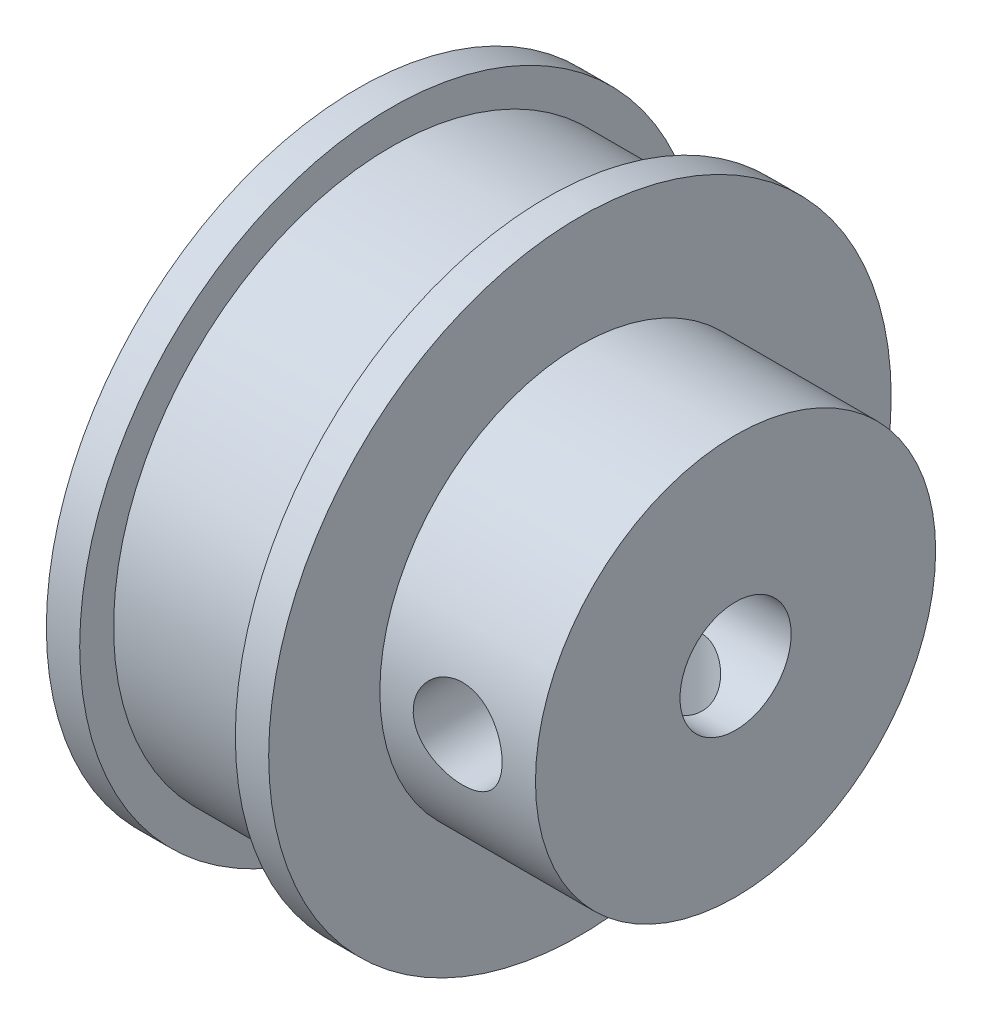
ISO-10303-21;
HEADER;
FILE_DESCRIPTION(('STEP AP214'),'2;1');
FILE_NAME('part.step','',(''),(''),'','','');
FILE_SCHEMA(('AUTOMOTIVE_DESIGN { 1 0 10303 214 1 1 1 1 }'));
ENDSEC;
DATA;
#1=APPLICATION_CONTEXT('core data for automotive mechanical design processes');
#2=APPLICATION_PROTOCOL_DEFINITION('international standard','automotive_design',2000,#1);
#3=PRODUCT_CONTEXT('',#1,'mechanical');
#4=PRODUCT('Part','Part','',(#3));
#5=PRODUCT_RELATED_PRODUCT_CATEGORY('part','',(#4));
#6=PRODUCT_DEFINITION_FORMATION('','',#4);
#7=PRODUCT_DEFINITION_CONTEXT('part definition',#1,'design');
#8=PRODUCT_DEFINITION('design','',#6,#7);
#9=PRODUCT_DEFINITION_SHAPE('','',#8);
#10=(LENGTH_UNIT() NAMED_UNIT(*) SI_UNIT(.MILLI.,.METRE.));
#11=(NAMED_UNIT(*) PLANE_ANGLE_UNIT() SI_UNIT($,.RADIAN.));
#12=(NAMED_UNIT(*) SI_UNIT($,.STERADIAN.) SOLID_ANGLE_UNIT());
#13=UNCERTAINTY_MEASURE_WITH_UNIT(LENGTH_MEASURE(1.E-05),#10,'distance_accuracy_value','');
#14=(GEOMETRIC_REPRESENTATION_CONTEXT(3) GLOBAL_UNCERTAINTY_ASSIGNED_CONTEXT((#13)) GLOBAL_UNIT_ASSIGNED_CONTEXT((#10,
#11,#12)) REPRESENTATION_CONTEXT('',''));
#15=CARTESIAN_POINT('',(0.,0.,0.));
#16=DIRECTION('',(0.,0.,1.));
#17=DIRECTION('',(1.,0.,0.));
#18=AXIS2_PLACEMENT_3D('',#15,#16,#17);
#19=CARTESIAN_POINT('',(0.,14.,0.));
#20=DIRECTION('',(-1.,0.,0.));
#21=DIRECTION('',(0.,0.,1.));
#22=AXIS2_PLACEMENT_3D('',#19,#20,#21);
#23=PLANE('',#22);
#24=CARTESIAN_POINT('',(0.,0.,0.));
#25=DIRECTION('',(1.,0.,0.));
#26=DIRECTION('',(0.,0.,-1.));
#27=AXIS2_PLACEMENT_3D('',#24,#25,#26);
#28=CIRCLE('',#27,2.5);
#29=CARTESIAN_POINT('',(0.,0.,-2.5));
#30=VERTEX_POINT('',#29);
#31=EDGE_CURVE('E11',#30,#30,#28,.T.);
#32=ORIENTED_EDGE('',*,*,#31,.T.);
#33=EDGE_LOOP('',(#32));
#34=FACE_BOUND('',#33,.T.);
#35=CARTESIAN_POINT('',(0.,0.,0.));
#36=DIRECTION('',(1.,0.,0.));
#37=DIRECTION('',(0.,0.,-1.));
#38=AXIS2_PLACEMENT_3D('',#35,#36,#37);
#39=CIRCLE('',#38,14.);
#40=CARTESIAN_POINT('',(0.,0.,-14.));
#41=VERTEX_POINT('',#40);
#42=EDGE_CURVE('E64',#41,#41,#39,.T.);
#43=ORIENTED_EDGE('',*,*,#42,.F.);
#44=EDGE_LOOP('',(#43));
#45=FACE_BOUND('',#44,.T.);
#46=ADVANCED_FACE('F34',(#34,#45),#23,.T.);
#47=CARTESIAN_POINT('',(17.85,0.,0.));
#48=DIRECTION('',(1.,0.,0.));
#49=DIRECTION('',(0.,0.,-1.));
#50=AXIS2_PLACEMENT_3D('',#47,#48,#49);
#51=CYLINDRICAL_SURFACE('',#50,2.5);
#52=CARTESIAN_POINT('',(13.5,2.,1.49999999999999));
#53=CARTESIAN_POINT('',(13.4249189826114,1.9999899563842,1.5000227575991));
#54=CARTESIAN_POINT('',(13.3497210739064,1.99572243014959,1.50575588676016));
#55=CARTESIAN_POINT('',(13.2016854705704,1.97904350434639,1.52759797098301));
#56=CARTESIAN_POINT('',(13.1288567781879,1.96660415938923,1.54374252679463));
#57=CARTESIAN_POINT('',(12.9623945804915,1.9288828901246,1.590783137644));
#58=CARTESIAN_POINT('',(12.8703574929005,1.90063587852784,1.62485949442394));
#59=CARTESIAN_POINT('',(12.6940318598387,1.83286412912235,1.70094533012842));
#60=CARTESIAN_POINT('',(12.6097660503329,1.79330760683741,1.74297705283045));
#61=CARTESIAN_POINT('',(12.4196603432195,1.68777756612173,1.84624966659378));
#62=CARTESIAN_POINT('',(12.3170334258727,1.61742363711761,1.90894188114929));
#63=CARTESIAN_POINT('',(12.1260231647878,1.4586193506474,2.03287996747902));
#64=CARTESIAN_POINT('',(12.0376280578861,1.37018407682201,2.0941269976447));
#65=CARTESIAN_POINT('',(11.8928950804225,1.19476026278807,2.1979067439451));
#66=CARTESIAN_POINT('',(11.8336737173159,1.1109337614669,2.24174680788007));
#67=CARTESIAN_POINT('',(11.7276340400337,0.932444755507572,2.32165152523267));
#68=CARTESIAN_POINT('',(11.6807964517991,0.837799422094959,2.35772824500367));
#69=CARTESIAN_POINT('',(11.6082870394193,0.655317082222557,2.41415644696378));
#70=CARTESIAN_POINT('',(11.5804174354239,0.568853585755704,2.43610736091392));
#71=CARTESIAN_POINT('',(11.536501304746,0.391188052922,2.47085912284979));
#72=CARTESIAN_POINT('',(11.52044831209,0.299988637312632,2.48366497483986));
#73=CARTESIAN_POINT('',(11.5011419067099,0.115048335136536,2.49907968883617));
#74=CARTESIAN_POINT('',(11.4979328073114,0.0212997713727099,2.50165324772141));
#75=CARTESIAN_POINT('',(11.5046642348722,-0.165416366428132,2.49626936144757));
#76=CARTESIAN_POINT('',(11.5146053703685,-0.258383904122224,2.48831142893578));
#77=CARTESIAN_POINT('',(11.546067986313,-0.435683568436089,2.4632836571348));
#78=CARTESIAN_POINT('',(11.5669288169561,-0.52021018891749,2.44673404857181));
#79=CARTESIAN_POINT('',(11.6186952342522,-0.684171862172418,2.40604493660584));
#80=CARTESIAN_POINT('',(11.6496033554976,-0.763605624129761,2.38190351809567));
#81=CARTESIAN_POINT('',(11.7236006985885,-0.923527318234425,2.32486221996811));
#82=CARTESIAN_POINT('',(11.7675765160147,-1.00337969293304,2.29134265660256));
#83=CARTESIAN_POINT('',(11.8645378595917,-1.15470891362335,2.2189404364648));
#84=CARTESIAN_POINT('',(11.9175284293631,-1.22618103296472,2.18005477975512));
#85=CARTESIAN_POINT('',(12.0430618687988,-1.37426521356106,2.09053510980241));
#86=CARTESIAN_POINT('',(12.1173836142049,-1.44890108738506,2.03913144290367));
#87=CARTESIAN_POINT('',(12.2762559036507,-1.58538384993671,1.93492377925711));
#88=CARTESIAN_POINT('',(12.3608188786743,-1.6472149443604,1.88211814269103));
#89=CARTESIAN_POINT('',(12.5312201958179,-1.75228528490804,1.78441317626437));
#90=CARTESIAN_POINT('',(12.6161509405137,-1.79674173995945,1.739242245538));
#91=CARTESIAN_POINT('',(12.7943664663345,-1.87389106987978,1.65582105773209));
#92=CARTESIAN_POINT('',(12.8876324203376,-1.90660965872837,1.6175557651669));
#93=CARTESIAN_POINT('',(13.0527916040278,-1.95062199735973,1.56393805143325));
#94=CARTESIAN_POINT('',(13.1226128308979,-1.96540293714783,1.54515601955457));
#95=CARTESIAN_POINT('',(13.2651802059541,-1.98746978122375,1.51667304681102));
#96=CARTESIAN_POINT('',(13.3379194539107,-1.99477239579984,1.50695186390374));
#97=CARTESIAN_POINT('',(13.4848633779274,-2.0012999442642,1.4982779029391));
#98=CARTESIAN_POINT('',(13.5590740850574,-2.00047806264257,1.49938753445574));
#99=CARTESIAN_POINT('',(13.7060473250374,-1.99072610261057,1.51230456185753));
#100=CARTESIAN_POINT('',(13.7788076663875,-1.98178458332098,1.52412705251966));
#101=CARTESIAN_POINT('',(13.9390632026618,-1.95331430449203,1.56051508430774));
#102=CARTESIAN_POINT('',(14.0255982681308,-1.93167092890879,1.58755721486229));
#103=CARTESIAN_POINT('',(14.1922908660855,-1.87841388450525,1.65022809339808));
#104=CARTESIAN_POINT('',(14.2724284809031,-1.84677049067316,1.6858823654909));
#105=CARTESIAN_POINT('',(14.4615289293493,-1.75807608919815,1.77903249993889));
#106=CARTESIAN_POINT('',(14.5668953343252,-1.69602510944931,1.83905564347524));
#107=CARTESIAN_POINT('',(14.764384149242,-1.55438039564657,1.96026853157684));
#108=CARTESIAN_POINT('',(14.8564907596835,-1.47476601547362,2.0214595710443));
#109=CARTESIAN_POINT('',(15.027462807345,-1.29702304107541,2.13993299259158));
#110=CARTESIAN_POINT('',(15.1061226291131,-1.19864860522963,2.19714788259661));
#111=CARTESIAN_POINT('',(15.2452665274442,-0.98497027774132,2.30083046289375));
#112=CARTESIAN_POINT('',(15.3058096056706,-0.869723203455192,2.34733292440641));
#113=CARTESIAN_POINT('',(15.3884905874669,-0.664531994140974,2.41163161860483));
#114=CARTESIAN_POINT('',(15.4167173769741,-0.578408265123336,2.43384921549886));
#115=CARTESIAN_POINT('',(15.461432134964,-0.401365381235633,2.46921550391513));
#116=CARTESIAN_POINT('',(15.4779290645406,-0.310449944179061,2.48237111815073));
#117=CARTESIAN_POINT('',(15.4981928241047,-0.125961358052304,2.49854699723994));
#118=CARTESIAN_POINT('',(15.5019132050583,-0.0323797561454496,2.50153028039159));
#119=CARTESIAN_POINT('',(15.4962334907348,0.154129494971554,2.4969871999336));
#120=CARTESIAN_POINT('',(15.4868324715917,0.24705709767119,2.48946009629711));
#121=CARTESIAN_POINT('',(15.4563964529088,0.424484983307848,2.46524008405095));
#122=CARTESIAN_POINT('',(15.4360106685972,0.509170159101619,2.449059003061));
#123=CARTESIAN_POINT('',(15.3851465786865,0.673520542356749,2.4090520196301));
#124=CARTESIAN_POINT('',(15.354665659174,0.753184443303531,2.38522413726749));
#125=CARTESIAN_POINT('',(15.2816254556074,0.913383591851873,2.32886203207213));
#126=CARTESIAN_POINT('',(15.238206157889,0.993310088153976,2.29572397002091));
#127=CARTESIAN_POINT('',(15.1423576629054,1.14486396126306,2.22403396009593));
#128=CARTESIAN_POINT('',(15.0899236819315,1.21648689776309,2.18547913977515));
#129=CARTESIAN_POINT('',(14.9657037869963,1.36488223995398,2.09666852429869));
#130=CARTESIAN_POINT('',(14.8921535866846,1.43970803793641,2.04563299169992));
#131=CARTESIAN_POINT('',(14.7348830744766,1.57669353079991,1.94201312920059));
#132=CARTESIAN_POINT('',(14.6511501723947,1.63883728583054,1.88942694411833));
#133=CARTESIAN_POINT('',(14.4810424554704,1.74551261366341,1.79109125321811));
#134=CARTESIAN_POINT('',(14.3954274787839,1.79106140064659,1.74513263017547));
#135=CARTESIAN_POINT('',(14.2156081117486,1.87016304685231,1.66007449903138));
#136=CARTESIAN_POINT('',(14.1214202219623,1.90373836359645,1.6209622208173));
#137=CARTESIAN_POINT('',(13.9538606732473,1.94914139922439,1.56580101941138));
#138=CARTESIAN_POINT('',(13.8825804555928,1.96446470848964,1.54635220628733));
#139=CARTESIAN_POINT('',(13.7369757290291,1.98726282623962,1.5169547222564));
#140=CARTESIAN_POINT('',(13.6626639447221,1.99476751139894,1.50696990066825));
#141=CARTESIAN_POINT('',(13.5586747856577,1.99935742227831,1.50085460132401));
#142=CARTESIAN_POINT('',(13.5293463217565,2.00000392566845,1.49999110491774));
#143=CARTESIAN_POINT('',(13.5,2.,1.49999999999999));
#144=B_SPLINE_CURVE_WITH_KNOTS('',3,(#52,#53,#54,#55,#56,#57,#58,#59,#60,#61,#62,#63,#64,#65,
#66,#67,#68,#69,#70,#71,#72,#73,#74,#75,#76,#77,#78,#79,#80,#81,#82,#83,#84,#85,#86,#87,#88,#89,
#90,#91,#92,#93,#94,#95,#96,#97,#98,#99,#100,#101,#102,#103,#104,#105,#106,#107,#108,#109,#110,
#111,#112,#113,#114,#115,#116,#117,#118,#119,#120,#121,#122,#123,#124,#125,#126,#127,#128,#129,
#130,#131,#132,#133,#134,#135,#136,#137,#138,#139,#140,#141,#142,#143),.UNSPECIFIED.,.T.,.F.,(4,
2,2,2,2,2,2,2,2,2,2,2,2,2,2,2,2,2,2,2,2,2,2,2,2,2,2,2,2,2,2,2,2,2,2,2,2,2,2,2,2,2,2,2,2,4),(0.,
0.225140818813293,0.451055593895016,0.755714384660878,1.06123795594964,1.47720804611674,
1.89283253536879,2.22639303179097,2.55943127851024,2.83862094435178,3.11765772560939,
3.39765639927928,3.67766803055209,3.94241917501297,4.20723715914625,4.49756510688427,
4.78805602626152,5.13841226546404,5.48919811771067,5.80619193384967,6.12248701337037,
6.34307726284837,6.56317352160417,6.78453876949455,7.00621641426758,7.28428560377194,
7.56318925297413,7.96975811975666,8.3768074872857,8.78961174948152,9.20105660259843,
9.4798592761315,9.75844872724252,10.0380499218877,10.3176708039936,10.5823344198312,
10.8470666181456,11.1364335884202,11.4259545900794,11.7747351905783,12.1239515037794,
12.4449574092071,12.7653580273015,12.9909138326702,13.2156045429056,13.3036035490356),.UNSPECIFIED.);
#145=CARTESIAN_POINT('',(14.4354143466935,-1.76776695296637,1.76776695296637));
#146=VERTEX_POINT('',#145);
#147=CARTESIAN_POINT('',(12.5645856533065,-1.76776695296637,1.76776695296637));
#148=VERTEX_POINT('',#147);
#149=EDGE_CURVE('E47',#146,#148,#144,.T.);
#150=ORIENTED_EDGE('',*,*,#149,.T.);
#151=CARTESIAN_POINT('',(13.5,-1.5,2.));
#152=CARTESIAN_POINT('',(13.4249189826114,-1.5000227575991,1.9999899563842));
#153=CARTESIAN_POINT('',(13.3497210739064,-1.50575588676017,1.99572243014959));
#154=CARTESIAN_POINT('',(13.2016854705704,-1.52759797098302,1.97904350434638));
#155=CARTESIAN_POINT('',(13.1288567781879,-1.54374252679464,1.96660415938922));
#156=CARTESIAN_POINT('',(12.9623945804914,-1.59078313764401,1.9288828901246));
#157=CARTESIAN_POINT('',(12.8703574929004,-1.62485949442395,1.90063587852784));
#158=CARTESIAN_POINT('',(12.6940318598387,-1.70094533012843,1.83286412912234));
#159=CARTESIAN_POINT('',(12.6097660503329,-1.74297705283046,1.79330760683741));
#160=CARTESIAN_POINT('',(12.4196603432195,-1.84624966659378,1.68777756612172));
#161=CARTESIAN_POINT('',(12.3170334258727,-1.90894188114929,1.6174236371176));
#162=CARTESIAN_POINT('',(12.1260231647878,-2.03287996747903,1.45861935064739));
#163=CARTESIAN_POINT('',(12.0376280578861,-2.0941269976447,1.370184076822));
#164=CARTESIAN_POINT('',(11.8928950804225,-2.19790674394511,1.19476026278806));
#165=CARTESIAN_POINT('',(11.8336737173159,-2.24174680788007,1.11093376146689));
#166=CARTESIAN_POINT('',(11.7276340400337,-2.32165152523267,0.932444755507561));
#167=CARTESIAN_POINT('',(11.6807964517991,-2.35772824500368,0.837799422094949));
#168=CARTESIAN_POINT('',(11.6082870394193,-2.41415644696378,0.655317082222547));
#169=CARTESIAN_POINT('',(11.5804174354239,-2.43610736091393,0.568853585755693));
#170=CARTESIAN_POINT('',(11.536501304746,-2.47085912284979,0.39118805292199));
#171=CARTESIAN_POINT('',(11.52044831209,-2.48366497483986,0.299988637312622));
#172=CARTESIAN_POINT('',(11.5011419067099,-2.49907968883617,0.115048335136527));
#173=CARTESIAN_POINT('',(11.4979328073114,-2.50165324772141,0.0212997713727005));
#174=CARTESIAN_POINT('',(11.5046642348722,-2.49626936144757,-0.165416366428141));
#175=CARTESIAN_POINT('',(11.5146053703685,-2.48831142893578,-0.258383904122233));
#176=CARTESIAN_POINT('',(11.546067986313,-2.4632836571348,-0.435683568436098));
#177=CARTESIAN_POINT('',(11.5669288169561,-2.44673404857181,-0.520210188917499));
#178=CARTESIAN_POINT('',(11.6186952342522,-2.40604493660584,-0.684171862172426));
#179=CARTESIAN_POINT('',(11.6496033554976,-2.38190351809567,-0.763605624129769));
#180=CARTESIAN_POINT('',(11.7236006985885,-2.32486221996811,-0.923527318234432));
#181=CARTESIAN_POINT('',(11.7675765160147,-2.29134265660255,-1.00337969293305));
#182=CARTESIAN_POINT('',(11.8645378595917,-2.21894043646479,-1.15470891362336));
#183=CARTESIAN_POINT('',(11.9175284293631,-2.18005477975512,-1.22618103296473));
#184=CARTESIAN_POINT('',(12.0430618687988,-2.09053510980241,-1.37426521356107));
#185=CARTESIAN_POINT('',(12.1173836142049,-2.03913144290366,-1.44890108738507));
#186=CARTESIAN_POINT('',(12.2762559036507,-1.9349237792571,-1.58538384993671));
#187=CARTESIAN_POINT('',(12.3608188786743,-1.88211814269102,-1.6472149443604));
#188=CARTESIAN_POINT('',(12.5312201958179,-1.78441317626437,-1.75228528490804));
#189=CARTESIAN_POINT('',(12.6161509405137,-1.73924224553799,-1.79674173995946));
#190=CARTESIAN_POINT('',(12.7943664663345,-1.65582105773209,-1.87389106987978));
#191=CARTESIAN_POINT('',(12.8876324203376,-1.61755576516689,-1.90660965872837));
#192=CARTESIAN_POINT('',(13.0527916040278,-1.56393805143324,-1.95062199735974));
#193=CARTESIAN_POINT('',(13.1226128308979,-1.54515601955456,-1.96540293714784));
#194=CARTESIAN_POINT('',(13.2651802059541,-1.51667304681101,-1.98746978122375));
#195=CARTESIAN_POINT('',(13.3379194539107,-1.50695186390373,-1.99477239579985));
#196=CARTESIAN_POINT('',(13.4848633779274,-1.49827790293909,-2.0012999442642));
#197=CARTESIAN_POINT('',(13.5590740850574,-1.49938753445573,-2.00047806264257));
#198=CARTESIAN_POINT('',(13.7060473250374,-1.51230456185753,-1.99072610261057));
#199=CARTESIAN_POINT('',(13.7788076663875,-1.52412705251965,-1.98178458332098));
#200=CARTESIAN_POINT('',(13.9390632026618,-1.56051508430773,-1.95331430449203));
#201=CARTESIAN_POINT('',(14.0255982681308,-1.58755721486228,-1.9316709289088));
#202=CARTESIAN_POINT('',(14.1922908660855,-1.65022809339808,-1.87841388450525));
#203=CARTESIAN_POINT('',(14.2724284809031,-1.6858823654909,-1.84677049067316));
#204=CARTESIAN_POINT('',(14.4615289293493,-1.77903249993889,-1.75807608919816));
#205=CARTESIAN_POINT('',(14.5668953343252,-1.83905564347523,-1.69602510944931));
#206=CARTESIAN_POINT('',(14.764384149242,-1.96026853157683,-1.55438039564658));
#207=CARTESIAN_POINT('',(14.8564907596835,-2.02145957104429,-1.47476601547362));
#208=CARTESIAN_POINT('',(15.027462807345,-2.13993299259157,-1.29702304107541));
#209=CARTESIAN_POINT('',(15.1061226291131,-2.1971478825966,-1.19864860522964));
#210=CARTESIAN_POINT('',(15.2452665274442,-2.30083046289374,-0.984970277741325));
#211=CARTESIAN_POINT('',(15.3058096056706,-2.3473329244064,-0.869723203455198));
#212=CARTESIAN_POINT('',(15.3884905874669,-2.41163161860482,-0.664531994140979));
#213=CARTESIAN_POINT('',(15.4167173769741,-2.43384921549886,-0.578408265123341));
#214=CARTESIAN_POINT('',(15.461432134964,-2.46921550391513,-0.401365381235638));
#215=CARTESIAN_POINT('',(15.4779290645406,-2.48237111815072,-0.310449944179066));
#216=CARTESIAN_POINT('',(15.4981928241047,-2.49854699723994,-0.12596135805231));
#217=CARTESIAN_POINT('',(15.5019132050583,-2.50153028039159,-0.0323797561454559));
#218=CARTESIAN_POINT('',(15.4962334907348,-2.4969871999336,0.154129494971548));
#219=CARTESIAN_POINT('',(15.4868324715917,-2.48946009629711,0.247057097671183));
#220=CARTESIAN_POINT('',(15.4563964529088,-2.46524008405095,0.424484983307841));
#221=CARTESIAN_POINT('',(15.4360106685972,-2.44905900306101,0.509170159101611));
#222=CARTESIAN_POINT('',(15.3851465786865,-2.4090520196301,0.673520542356741));
#223=CARTESIAN_POINT('',(15.354665659174,-2.3852241372675,0.753184443303523));
#224=CARTESIAN_POINT('',(15.2816254556074,-2.32886203207213,0.913383591851866));
#225=CARTESIAN_POINT('',(15.238206157889,-2.29572397002092,0.99331008815397));
#226=CARTESIAN_POINT('',(15.1423576629054,-2.22403396009593,1.14486396126305));
#227=CARTESIAN_POINT('',(15.0899236819315,-2.18547913977516,1.21648689776308));
#228=CARTESIAN_POINT('',(14.9657037869963,-2.0966685242987,1.36488223995397));
#229=CARTESIAN_POINT('',(14.8921535866846,-2.04563299169992,1.4397080379364));
#230=CARTESIAN_POINT('',(14.7348830744766,-1.9420131292006,1.5766935307999));
#231=CARTESIAN_POINT('',(14.6511501723947,-1.88942694411833,1.63883728583053));
#232=CARTESIAN_POINT('',(14.4810424554704,-1.79109125321811,1.7455126136634));
#233=CARTESIAN_POINT('',(14.3954274787839,-1.74513263017548,1.79106140064659));
#234=CARTESIAN_POINT('',(14.2156081117486,-1.66007449903139,1.87016304685231));
#235=CARTESIAN_POINT('',(14.1214202219623,-1.6209622208173,1.90373836359645));
#236=CARTESIAN_POINT('',(13.9538606732473,-1.56580101941138,1.94914139922438));
#237=CARTESIAN_POINT('',(13.8825804555928,-1.54635220628734,1.96446470848963));
#238=CARTESIAN_POINT('',(13.7369757290291,-1.51695472225641,1.98726282623961));
#239=CARTESIAN_POINT('',(13.6626639447221,-1.50696990066825,1.99476751139893));
#240=CARTESIAN_POINT('',(13.5586747856577,-1.50085460132402,1.99935742227831));
#241=CARTESIAN_POINT('',(13.5293463217565,-1.49999110491774,2.00000392566845));
#242=CARTESIAN_POINT('',(13.5,-1.5,2.));
#243=B_SPLINE_CURVE_WITH_KNOTS('',3,(#151,#152,#153,#154,#155,#156,#157,#158,#159,#160,#161,
#162,#163,#164,#165,#166,#167,#168,#169,#170,#171,#172,#173,#174,#175,#176,#177,#178,#179,#180,
#181,#182,#183,#184,#185,#186,#187,#188,#189,#190,#191,#192,#193,#194,#195,#196,#197,#198,#199,
#200,#201,#202,#203,#204,#205,#206,#207,#208,#209,#210,#211,#212,#213,#214,#215,#216,#217,#218,
#219,#220,#221,#222,#223,#224,#225,#226,#227,#228,#229,#230,#231,#232,#233,#234,#235,#236,#237,
#238,#239,#240,#241,#242),.UNSPECIFIED.,.T.,.F.,(4,2,2,2,2,2,2,2,2,2,2,2,2,2,2,2,2,2,2,2,2,2,2,
2,2,2,2,2,2,2,2,2,2,2,2,2,2,2,2,2,2,2,2,2,2,4),(0.,0.225140818813293,0.451055593895018,
0.75571438466088,1.06123795594964,1.47720804611674,1.8928325353688,2.22639303179097,
2.55943127851024,2.83862094435178,3.11765772560939,3.39765639927928,3.67766803055209,
3.94241917501297,4.20723715914625,4.49756510688427,4.78805602626152,5.13841226546404,
5.48919811771067,5.80619193384967,6.12248701337037,6.34307726284837,6.56317352160417,
6.78453876949455,7.00621641426759,7.28428560377195,7.56318925297414,7.96975811975667,
8.3768074872857,8.78961174948153,9.20105660259844,9.47985927613151,9.75844872724252,
10.0380499218877,10.3176708039936,10.5823344198312,10.8470666181456,11.1364335884202,
11.4259545900794,11.7747351905783,12.1239515037794,12.4449574092071,12.7653580273015,
12.9909138326702,13.2156045429056,13.3036035490356),.UNSPECIFIED.);
#244=EDGE_CURVE('E59',#148,#146,#243,.T.);
#245=ORIENTED_EDGE('',*,*,#244,.T.);
#246=EDGE_LOOP('',(#150,#245));
#247=FACE_BOUND('',#246,.T.);
#248=CARTESIAN_POINT('',(17.,0.,0.));
#249=DIRECTION('',(1.,0.,0.));
#250=DIRECTION('',(0.,0.,-1.));
#251=AXIS2_PLACEMENT_3D('',#248,#249,#250);
#252=CIRCLE('',#251,2.5);
#253=CARTESIAN_POINT('',(17.,0.,-2.5));
#254=VERTEX_POINT('',#253);
#255=EDGE_CURVE('E41',#254,#254,#252,.T.);
#256=ORIENTED_EDGE('',*,*,#255,.T.);
#257=EDGE_LOOP('',(#256));
#258=FACE_BOUND('',#257,.T.);
#259=ORIENTED_EDGE('',*,*,#31,.F.);
#260=EDGE_LOOP('',(#259));
#261=FACE_BOUND('',#260,.T.);
#262=ADVANCED_FACE('F57',(#247,#258,#261),#51,.F.);
#263=CARTESIAN_POINT('',(17.,2.5,0.));
#264=DIRECTION('',(1.,0.,0.));
#265=DIRECTION('',(0.,0.,-1.));
#266=AXIS2_PLACEMENT_3D('',#263,#264,#265);
#267=PLANE('',#266);
#268=CARTESIAN_POINT('',(17.,0.,0.));
#269=DIRECTION('',(1.,0.,0.));
#270=DIRECTION('',(0.,0.,-1.));
#271=AXIS2_PLACEMENT_3D('',#268,#269,#270);
#272=CIRCLE('',#271,9.);
#273=CARTESIAN_POINT('',(17.,0.,-9.));
#274=VERTEX_POINT('',#273);
#275=EDGE_CURVE('E118',#274,#274,#272,.T.);
#276=ORIENTED_EDGE('',*,*,#275,.T.);
#277=EDGE_LOOP('',(#276));
#278=FACE_BOUND('',#277,.T.);
#279=ORIENTED_EDGE('',*,*,#255,.F.);
#280=EDGE_LOOP('',(#279));
#281=FACE_BOUND('',#280,.T.);
#282=ADVANCED_FACE('F108',(#278,#281),#267,.T.);
#283=CARTESIAN_POINT('',(17.85,0.,0.));
#284=DIRECTION('',(1.,0.,0.));
#285=DIRECTION('',(0.,0.,-1.));
#286=AXIS2_PLACEMENT_3D('',#283,#284,#285);
#287=CYLINDRICAL_SURFACE('',#286,9.);
#288=CARTESIAN_POINT('',(13.5,2.00000000000003,8.77496438739212));
#289=CARTESIAN_POINT('',(13.610842367716,1.99999624947951,8.77496662645732));
#290=CARTESIAN_POINT('',(13.7217294126585,1.99075413145668,8.77708745359839));
#291=CARTESIAN_POINT('',(13.9403468260889,1.95407223666288,8.78532539051411));
#292=CARTESIAN_POINT('',(14.048074903416,1.92661957701428,8.79144532937729));
#293=CARTESIAN_POINT('',(14.2571804222697,1.85442638312282,8.80695492376763));
#294=CARTESIAN_POINT('',(14.3585648140004,1.80970516800613,8.81634092424592));
#295=CARTESIAN_POINT('',(14.5523950070571,1.70430003435314,8.83732066308218));
#296=CARTESIAN_POINT('',(14.6448409317429,1.64361633615815,8.84891437096502));
#297=CARTESIAN_POINT('',(14.8197825713684,1.50688107459126,8.87322903283376));
#298=CARTESIAN_POINT('',(14.9020997621197,1.43060369779222,8.88596479825902));
#299=CARTESIAN_POINT('',(15.052882752439,1.26533367886368,8.91099903447158));
#300=CARTESIAN_POINT('',(15.1213474536437,1.17634002941521,8.92329747051937));
#301=CARTESIAN_POINT('',(15.2431907513953,0.986963945237595,8.94623292801725));
#302=CARTESIAN_POINT('',(15.2963972494531,0.886468216533106,8.95685043407434));
#303=CARTESIAN_POINT('',(15.3850998017205,0.677686335651974,8.97506024335485));
#304=CARTESIAN_POINT('',(15.420597908471,0.569401088006983,8.98265289716175));
#305=CARTESIAN_POINT('',(15.4723134329389,0.349970796328365,8.99385284467252));
#306=CARTESIAN_POINT('',(15.4888331092004,0.238900228261951,8.99752254926932));
#307=CARTESIAN_POINT('',(15.5030682708724,0.0155076577860528,9.00067948952038));
#308=CARTESIAN_POINT('',(15.5007859739338,-0.0968141954765151,9.00016721842944));
#309=CARTESIAN_POINT('',(15.477706277504,-0.317435920934316,8.99506549351281));
#310=CARTESIAN_POINT('',(15.4572347209089,-0.425771784327122,8.99054779604675));
#311=CARTESIAN_POINT('',(15.3988773324448,-0.637430845543386,8.97802477302305));
#312=CARTESIAN_POINT('',(15.3609906967467,-0.740753811742778,8.97001928648017));
#313=CARTESIAN_POINT('',(15.2685930258991,-0.940353769390901,8.95130538605656));
#314=CARTESIAN_POINT('',(15.2139592834556,-1.03657202089399,8.94057712552793));
#315=CARTESIAN_POINT('',(15.089709906051,-1.21859313654478,8.91759271684018));
#316=CARTESIAN_POINT('',(15.02009216893,-1.30439453662951,8.9053363543996));
#317=CARTESIAN_POINT('',(14.866079806147,-1.4650849895808,8.88033165726826));
#318=CARTESIAN_POINT('',(14.7814000240292,-1.53970021847618,8.86757840960139));
#319=CARTESIAN_POINT('',(14.6005972523829,-1.67372303020543,8.84326321441833));
#320=CARTESIAN_POINT('',(14.5044739322257,-1.7331301734881,8.83170130134043));
#321=CARTESIAN_POINT('',(14.3030601116513,-1.83517765915969,8.81106433565089));
#322=CARTESIAN_POINT('',(14.1977417771953,-1.87776477440727,8.80199720482961));
#323=CARTESIAN_POINT('',(13.9811938287177,-1.94455269523165,8.78748514090365));
#324=CARTESIAN_POINT('',(13.8699651891427,-1.96875652170472,8.78203961268515));
#325=CARTESIAN_POINT('',(13.6472600129403,-1.997662989002,8.77550908494629));
#326=CARTESIAN_POINT('',(13.5358378689601,-2.00276498767793,8.7743348025086));
#327=CARTESIAN_POINT('',(13.3137350770374,-1.99440547424343,8.77623864525493));
#328=CARTESIAN_POINT('',(13.2030543769416,-1.98094528187576,8.77931646812094));
#329=CARTESIAN_POINT('',(12.9869764625034,-1.93619037322693,8.78929328275127));
#330=CARTESIAN_POINT('',(12.8815310247037,-1.9051169265443,8.79614483669033));
#331=CARTESIAN_POINT('',(12.6773433688713,-1.82625775138721,8.81285408505847));
#332=CARTESIAN_POINT('',(12.5786018105005,-1.7784703811001,8.82271207479828));
#333=CARTESIAN_POINT('',(12.3889003982236,-1.66666470166545,8.84451874051648));
#334=CARTESIAN_POINT('',(12.2980886850149,-1.60240114470841,8.85649807643978));
#335=CARTESIAN_POINT('',(12.1283916425913,-1.45978704293769,8.88111742013187));
#336=CARTESIAN_POINT('',(12.0495078469714,-1.3814346895309,8.89375751257471));
#337=CARTESIAN_POINT('',(11.9043486564914,-1.21105721461459,8.91856933927249));
#338=CARTESIAN_POINT('',(11.8383459641305,-1.11879740983624,8.93072732731513));
#339=CARTESIAN_POINT('',(11.722775865766,-0.924268162142554,8.95294911443443));
#340=CARTESIAN_POINT('',(11.6732076793666,-0.821999194813028,8.96301301294089));
#341=CARTESIAN_POINT('',(11.5922898853666,-0.611001900003262,8.97985488719582));
#342=CARTESIAN_POINT('',(11.5608228041058,-0.502320388174374,8.9866540021859));
#343=CARTESIAN_POINT('',(11.5166348399835,-0.281045086795558,8.99629176699512));
#344=CARTESIAN_POINT('',(11.5039111392862,-0.168451887925154,8.99913101212837));
#345=CARTESIAN_POINT('',(11.497701217631,0.054864845540405,9.0005107520028));
#346=CARTESIAN_POINT('',(11.5038083693407,0.165576705736231,8.99914211230489));
#347=CARTESIAN_POINT('',(11.5341749505568,0.384354041366184,8.9924552646312));
#348=CARTESIAN_POINT('',(11.558434033095,0.492419567343322,8.98713713214866));
#349=CARTESIAN_POINT('',(11.6242183571947,0.702510284786674,8.97315637064447));
#350=CARTESIAN_POINT('',(11.6656842239007,0.804554882640577,8.9645052499262));
#351=CARTESIAN_POINT('',(11.7646478035395,1.00029152809307,8.94478087317809));
#352=CARTESIAN_POINT('',(11.8221471261802,1.09398273579073,8.93370737397322));
#353=CARTESIAN_POINT('',(11.9528622774631,1.27233089951001,8.91007482615536));
#354=CARTESIAN_POINT('',(12.0263630356894,1.35677575839297,8.89749099486293));
#355=CARTESIAN_POINT('',(12.1864221364524,1.51227173235311,8.87238707177687));
#356=CARTESIAN_POINT('',(12.2729836357901,1.58331959999149,8.85986699615144));
#357=CARTESIAN_POINT('',(12.458154499788,1.71095851141987,8.83611370166477));
#358=CARTESIAN_POINT('',(12.5569146167407,1.76733485857978,8.82490079106851));
#359=CARTESIAN_POINT('',(12.7627368953712,1.8626002632467,8.80528840186491));
#360=CARTESIAN_POINT('',(12.8697920441057,1.90150390773302,8.79688657793932));
#361=CARTESIAN_POINT('',(13.0641064740553,1.95389349465738,8.78537621740405));
#362=CARTESIAN_POINT('',(13.1503234272735,1.97114982047988,8.78149804514396));
#363=CARTESIAN_POINT('',(13.3243509565802,1.99420426170612,8.77629130915145));
#364=CARTESIAN_POINT('',(13.4121614496705,2.00000297215131,8.77496261301427));
#365=CARTESIAN_POINT('',(13.5,2.00000000000003,8.77496438739212));
#366=B_SPLINE_CURVE_WITH_KNOTS('',3,(#288,#289,#290,#291,#292,#293,#294,#295,#296,#297,#298,
#299,#300,#301,#302,#303,#304,#305,#306,#307,#308,#309,#310,#311,#312,#313,#314,#315,#316,#317,
#318,#319,#320,#321,#322,#323,#324,#325,#326,#327,#328,#329,#330,#331,#332,#333,#334,#335,#336,
#337,#338,#339,#340,#341,#342,#343,#344,#345,#346,#347,#348,#349,#350,#351,#352,#353,#354,#355,
#356,#357,#358,#359,#360,#361,#362,#363,#364,#365),.UNSPECIFIED.,.T.,.F.,(4,2,2,2,2,2,2,2,2,2,2,
2,2,2,2,2,2,2,2,2,2,2,2,2,2,2,2,2,2,2,2,2,2,2,2,2,2,2,4),(0.,0.332205117020653,
0.664645500445896,0.99671504007781,1.32877999616248,1.66604593919643,2.00333861356302,
2.34429812642809,2.68521811023267,3.02062971478989,3.35600175886082,3.68548441840912,
4.0149822874403,4.34695458006495,4.67897347670087,5.01812047297981,5.35727727033735,
5.69749889450325,6.0376645984937,6.37067749516634,6.70366671636338,7.03256257950694,
7.3614907592462,7.69563228727099,8.02981674004574,8.37045046043533,8.71106800344854,
9.04944929455635,9.38777970902403,9.71885587565259,10.0499257140336,10.3798625177934,
10.7098324580937,11.0462446945479,11.3827383729968,11.7239097153546,12.0647957010371,
12.3280698629932,12.5913303516713),.UNSPECIFIED.);
#367=CARTESIAN_POINT('',(13.5,2.00000000000003,8.77496438739212));
#368=VERTEX_POINT('',#367);
#369=EDGE_CURVE('E54',#368,#368,#366,.T.);
#370=ORIENTED_EDGE('',*,*,#369,.T.);
#371=EDGE_LOOP('',(#370));
#372=FACE_BOUND('',#371,.T.);
#373=CARTESIAN_POINT('',(13.5,-8.77496438739212,2.));
#374=CARTESIAN_POINT('',(13.610842367716,-8.77496662645733,1.99999624947948));
#375=CARTESIAN_POINT('',(13.7217294126585,-8.7770874535984,1.99075413145665));
#376=CARTESIAN_POINT('',(13.9403468260889,-8.78532539051412,1.95407223666285));
#377=CARTESIAN_POINT('',(14.048074903416,-8.7914453293773,1.92661957701425));
#378=CARTESIAN_POINT('',(14.2571804222697,-8.80695492376764,1.85442638312279));
#379=CARTESIAN_POINT('',(14.3585648140004,-8.81634092424592,1.8097051680061));
#380=CARTESIAN_POINT('',(14.5523950070571,-8.83732066308219,1.70430003435311));
#381=CARTESIAN_POINT('',(14.6448409317429,-8.84891437096502,1.64361633615812));
#382=CARTESIAN_POINT('',(14.8197825713684,-8.87322903283376,1.50688107459123));
#383=CARTESIAN_POINT('',(14.9020997621197,-8.88596479825903,1.43060369779219));
#384=CARTESIAN_POINT('',(15.052882752439,-8.91099903447159,1.26533367886365));
#385=CARTESIAN_POINT('',(15.1213474536437,-8.92329747051937,1.17634002941518));
#386=CARTESIAN_POINT('',(15.2431907513953,-8.94623292801726,0.986963945237564));
#387=CARTESIAN_POINT('',(15.2963972494531,-8.95685043407434,0.886468216533076));
#388=CARTESIAN_POINT('',(15.3850998017205,-8.97506024335485,0.677686335651943));
#389=CARTESIAN_POINT('',(15.420597908471,-8.98265289716175,0.569401088006953));
#390=CARTESIAN_POINT('',(15.4723134329389,-8.99385284467253,0.349970796328334));
#391=CARTESIAN_POINT('',(15.4888331092004,-8.99752254926933,0.238900228261921));
#392=CARTESIAN_POINT('',(15.5030682708724,-9.00067948952038,0.0155076577860219));
#393=CARTESIAN_POINT('',(15.5007859739338,-9.00016721842944,-0.0968141954765461));
#394=CARTESIAN_POINT('',(15.477706277504,-8.99506549351281,-0.317435920934348));
#395=CARTESIAN_POINT('',(15.4572347209089,-8.99054779604675,-0.425771784327153));
#396=CARTESIAN_POINT('',(15.3988773324448,-8.97802477302305,-0.637430845543417));
#397=CARTESIAN_POINT('',(15.3609906967467,-8.97001928648017,-0.740753811742809));
#398=CARTESIAN_POINT('',(15.2685930258991,-8.95130538605655,-0.940353769390932));
#399=CARTESIAN_POINT('',(15.2139592834556,-8.94057712552793,-1.03657202089402));
#400=CARTESIAN_POINT('',(15.089709906051,-8.91759271684017,-1.21859313654481));
#401=CARTESIAN_POINT('',(15.02009216893,-8.9053363543996,-1.30439453662954));
#402=CARTESIAN_POINT('',(14.866079806147,-8.88033165726826,-1.46508498958083));
#403=CARTESIAN_POINT('',(14.7814000240292,-8.86757840960138,-1.53970021847621));
#404=CARTESIAN_POINT('',(14.6005972523829,-8.84326321441833,-1.67372303020546));
#405=CARTESIAN_POINT('',(14.5044739322257,-8.83170130134042,-1.73313017348813));
#406=CARTESIAN_POINT('',(14.3030601116513,-8.81106433565089,-1.83517765915972));
#407=CARTESIAN_POINT('',(14.1977417771953,-8.8019972048296,-1.8777647744073));
#408=CARTESIAN_POINT('',(13.9811938287177,-8.78748514090364,-1.94455269523168));
#409=CARTESIAN_POINT('',(13.8699651891427,-8.78203961268514,-1.96875652170475));
#410=CARTESIAN_POINT('',(13.6472600129403,-8.77550908494629,-1.99766298900203));
#411=CARTESIAN_POINT('',(13.5358378689601,-8.77433480250859,-2.00276498767796));
#412=CARTESIAN_POINT('',(13.3137350770374,-8.77623864525492,-1.99440547424347));
#413=CARTESIAN_POINT('',(13.2030543769416,-8.77931646812094,-1.98094528187579));
#414=CARTESIAN_POINT('',(12.9869764625034,-8.78929328275126,-1.93619037322696));
#415=CARTESIAN_POINT('',(12.8815310247037,-8.79614483669032,-1.90511692654433));
#416=CARTESIAN_POINT('',(12.6773433688713,-8.81285408505847,-1.82625775138724));
#417=CARTESIAN_POINT('',(12.5786018105005,-8.82271207479827,-1.77847038110013));
#418=CARTESIAN_POINT('',(12.3889003982236,-8.84451874051647,-1.66666470166548));
#419=CARTESIAN_POINT('',(12.2980886850149,-8.85649807643978,-1.60240114470844));
#420=CARTESIAN_POINT('',(12.1283916425913,-8.88111742013187,-1.45978704293772));
#421=CARTESIAN_POINT('',(12.0495078469714,-8.8937575125747,-1.38143468953093));
#422=CARTESIAN_POINT('',(11.9043486564914,-8.91856933927249,-1.21105721461462));
#423=CARTESIAN_POINT('',(11.8383459641305,-8.93072732731512,-1.11879740983627));
#424=CARTESIAN_POINT('',(11.722775865766,-8.95294911443443,-0.924268162142587));
#425=CARTESIAN_POINT('',(11.6732076793666,-8.96301301294089,-0.821999194813061));
#426=CARTESIAN_POINT('',(11.5922898853666,-8.97985488719582,-0.611001900003294));
#427=CARTESIAN_POINT('',(11.5608228041058,-8.98665400218589,-0.502320388174405));
#428=CARTESIAN_POINT('',(11.5166348399835,-8.99629176699512,-0.281045086795589));
#429=CARTESIAN_POINT('',(11.5039111392862,-8.99913101212837,-0.168451887925186));
#430=CARTESIAN_POINT('',(11.497701217631,-9.0005107520028,0.0548648455403733));
#431=CARTESIAN_POINT('',(11.5038083693407,-8.99914211230489,0.165576705736199));
#432=CARTESIAN_POINT('',(11.5341749505568,-8.9924552646312,0.384354041366152));
#433=CARTESIAN_POINT('',(11.558434033095,-8.98713713214866,0.49241956734329));
#434=CARTESIAN_POINT('',(11.6242183571947,-8.97315637064447,0.702510284786643));
#435=CARTESIAN_POINT('',(11.6656842239007,-8.9645052499262,0.804554882640545));
#436=CARTESIAN_POINT('',(11.7646478035395,-8.9447808731781,1.00029152809304));
#437=CARTESIAN_POINT('',(11.8221471261802,-8.93370737397323,1.0939827357907));
#438=CARTESIAN_POINT('',(11.9528622774631,-8.91007482615536,1.27233089950998));
#439=CARTESIAN_POINT('',(12.0263630356894,-8.89749099486293,1.35677575839294));
#440=CARTESIAN_POINT('',(12.1864221364524,-8.87238707177688,1.51227173235308));
#441=CARTESIAN_POINT('',(12.2729836357901,-8.85986699615144,1.58331959999146));
#442=CARTESIAN_POINT('',(12.458154499788,-8.83611370166478,1.71095851141984));
#443=CARTESIAN_POINT('',(12.5569146167407,-8.82490079106851,1.76733485857975));
#444=CARTESIAN_POINT('',(12.7627368953712,-8.80528840186491,1.86260026324667));
#445=CARTESIAN_POINT('',(12.8697920441057,-8.79688657793932,1.90150390773299));
#446=CARTESIAN_POINT('',(13.0641064740553,-8.78537621740405,1.95389349465735));
#447=CARTESIAN_POINT('',(13.1503234272735,-8.78149804514396,1.97114982047985));
#448=CARTESIAN_POINT('',(13.3243509565802,-8.77629130915146,1.99420426170609));
#449=CARTESIAN_POINT('',(13.4121614496705,-8.77496261301428,2.00000297215128));
#450=CARTESIAN_POINT('',(13.5,-8.77496438739212,2.));
#451=B_SPLINE_CURVE_WITH_KNOTS('',3,(#373,#374,#375,#376,#377,#378,#379,#380,#381,#382,#383,
#384,#385,#386,#387,#388,#389,#390,#391,#392,#393,#394,#395,#396,#397,#398,#399,#400,#401,#402,
#403,#404,#405,#406,#407,#408,#409,#410,#411,#412,#413,#414,#415,#416,#417,#418,#419,#420,#421,
#422,#423,#424,#425,#426,#427,#428,#429,#430,#431,#432,#433,#434,#435,#436,#437,#438,#439,#440,
#441,#442,#443,#444,#445,#446,#447,#448,#449,#450),.UNSPECIFIED.,.T.,.F.,(4,2,2,2,2,2,2,2,2,2,2,
2,2,2,2,2,2,2,2,2,2,2,2,2,2,2,2,2,2,2,2,2,2,2,2,2,2,2,4),(0.,0.332205117020653,
0.664645500445896,0.99671504007781,1.32877999616248,1.66604593919643,2.00333861356302,
2.34429812642809,2.68521811023267,3.02062971478989,3.35600175886082,3.68548441840912,
4.0149822874403,4.34695458006495,4.67897347670087,5.01812047297981,5.35727727033735,
5.69749889450325,6.0376645984937,6.37067749516633,6.70366671636337,7.03256257950694,
7.3614907592462,7.69563228727099,8.02981674004573,8.37045046043533,8.71106800344854,
9.04944929455635,9.38777970902404,9.71885587565259,10.0499257140336,10.3798625177934,
10.7098324580937,11.0462446945479,11.3827383729968,11.7239097153546,12.0647957010371,
12.3280698629932,12.5913303516713),.UNSPECIFIED.);
#452=CARTESIAN_POINT('',(13.5,-8.77496438739212,2.));
#453=VERTEX_POINT('',#452);
#454=EDGE_CURVE('E60',#453,#453,#451,.T.);
#455=ORIENTED_EDGE('',*,*,#454,.T.);
#456=EDGE_LOOP('',(#455));
#457=FACE_BOUND('',#456,.T.);
#458=CARTESIAN_POINT('',(10.,0.,0.));
#459=DIRECTION('',(1.,0.,0.));
#460=DIRECTION('',(0.,0.,-1.));
#461=AXIS2_PLACEMENT_3D('',#458,#459,#460);
#462=CIRCLE('',#461,9.);
#463=CARTESIAN_POINT('',(10.,0.,-9.));
#464=VERTEX_POINT('',#463);
#465=EDGE_CURVE('E115',#464,#464,#462,.T.);
#466=ORIENTED_EDGE('',*,*,#465,.T.);
#467=EDGE_LOOP('',(#466));
#468=FACE_BOUND('',#467,.T.);
#469=ORIENTED_EDGE('',*,*,#275,.F.);
#470=EDGE_LOOP('',(#469));
#471=FACE_BOUND('',#470,.T.);
#472=ADVANCED_FACE('F104',(#372,#457,#468,#471),#287,.T.);
#473=CARTESIAN_POINT('',(10.,9.,0.));
#474=DIRECTION('',(1.,0.,0.));
#475=DIRECTION('',(0.,0.,-1.));
#476=AXIS2_PLACEMENT_3D('',#473,#474,#475);
#477=PLANE('',#476);
#478=CARTESIAN_POINT('',(10.,0.,0.));
#479=DIRECTION('',(1.,0.,0.));
#480=DIRECTION('',(0.,0.,-1.));
#481=AXIS2_PLACEMENT_3D('',#478,#479,#480);
#482=CIRCLE('',#481,14.);
#483=CARTESIAN_POINT('',(10.,0.,-14.));
#484=VERTEX_POINT('',#483);
#485=EDGE_CURVE('E122',#484,#484,#482,.T.);
#486=ORIENTED_EDGE('',*,*,#485,.T.);
#487=EDGE_LOOP('',(#486));
#488=FACE_BOUND('',#487,.T.);
#489=ORIENTED_EDGE('',*,*,#465,.F.);
#490=EDGE_LOOP('',(#489));
#491=FACE_BOUND('',#490,.T.);
#492=ADVANCED_FACE('F107',(#488,#491),#477,.T.);
#493=CARTESIAN_POINT('',(17.85,0.,0.));
#494=DIRECTION('',(1.,0.,0.));
#495=DIRECTION('',(0.,0.,-1.));
#496=AXIS2_PLACEMENT_3D('',#493,#494,#495);
#497=CYLINDRICAL_SURFACE('',#496,14.);
#498=CARTESIAN_POINT('',(8.5,0.,0.));
#499=DIRECTION('',(1.,0.,0.));
#500=DIRECTION('',(0.,0.,-1.));
#501=AXIS2_PLACEMENT_3D('',#498,#499,#500);
#502=CIRCLE('',#501,14.);
#503=CARTESIAN_POINT('',(8.5,0.,-14.));
#504=VERTEX_POINT('',#503);
#505=EDGE_CURVE('E127',#504,#504,#502,.T.);
#506=ORIENTED_EDGE('',*,*,#505,.T.);
#507=EDGE_LOOP('',(#506));
#508=FACE_BOUND('',#507,.T.);
#509=ORIENTED_EDGE('',*,*,#485,.F.);
#510=EDGE_LOOP('',(#509));
#511=FACE_BOUND('',#510,.T.);
#512=ADVANCED_FACE('F166',(#508,#511),#497,.T.);
#513=CARTESIAN_POINT('',(8.5,14.,0.));
#514=DIRECTION('',(-1.,0.,0.));
#515=DIRECTION('',(0.,0.,1.));
#516=AXIS2_PLACEMENT_3D('',#513,#514,#515);
#517=PLANE('',#516);
#518=CARTESIAN_POINT('',(8.5,0.,0.));
#519=DIRECTION('',(1.,0.,0.));
#520=DIRECTION('',(0.,0.,-1.));
#521=AXIS2_PLACEMENT_3D('',#518,#519,#520);
#522=CIRCLE('',#521,12.475);
#523=CARTESIAN_POINT('',(8.5,0.,-12.475));
#524=VERTEX_POINT('',#523);
#525=EDGE_CURVE('E130',#524,#524,#522,.T.);
#526=ORIENTED_EDGE('',*,*,#525,.T.);
#527=EDGE_LOOP('',(#526));
#528=FACE_BOUND('',#527,.T.);
#529=ORIENTED_EDGE('',*,*,#505,.F.);
#530=EDGE_LOOP('',(#529));
#531=FACE_BOUND('',#530,.T.);
#532=ADVANCED_FACE('F170',(#528,#531),#517,.T.);
#533=CARTESIAN_POINT('',(17.85,0.,0.));
#534=DIRECTION('',(1.,0.,0.));
#535=DIRECTION('',(0.,0.,-1.));
#536=AXIS2_PLACEMENT_3D('',#533,#534,#535);
#537=CYLINDRICAL_SURFACE('',#536,12.475);
#538=CARTESIAN_POINT('',(1.5,0.,0.));
#539=DIRECTION('',(1.,0.,0.));
#540=DIRECTION('',(0.,0.,-1.));
#541=AXIS2_PLACEMENT_3D('',#538,#539,#540);
#542=CIRCLE('',#541,12.475);
#543=CARTESIAN_POINT('',(1.5,0.,-12.475));
#544=VERTEX_POINT('',#543);
#545=EDGE_CURVE('E133',#544,#544,#542,.T.);
#546=ORIENTED_EDGE('',*,*,#545,.T.);
#547=EDGE_LOOP('',(#546));
#548=FACE_BOUND('',#547,.T.);
#549=ORIENTED_EDGE('',*,*,#525,.F.);
#550=EDGE_LOOP('',(#549));
#551=FACE_BOUND('',#550,.T.);
#552=ADVANCED_FACE('F148',(#548,#551),#537,.T.);
#553=CARTESIAN_POINT('',(1.5,12.475,0.));
#554=DIRECTION('',(1.,0.,0.));
#555=DIRECTION('',(0.,0.,-1.));
#556=AXIS2_PLACEMENT_3D('',#553,#554,#555);
#557=PLANE('',#556);
#558=CARTESIAN_POINT('',(1.5,0.,0.));
#559=DIRECTION('',(1.,0.,0.));
#560=DIRECTION('',(0.,0.,-1.));
#561=AXIS2_PLACEMENT_3D('',#558,#559,#560);
#562=CIRCLE('',#561,14.);
#563=CARTESIAN_POINT('',(1.5,0.,-14.));
#564=VERTEX_POINT('',#563);
#565=EDGE_CURVE('E67',#564,#564,#562,.T.);
#566=ORIENTED_EDGE('',*,*,#565,.T.);
#567=EDGE_LOOP('',(#566));
#568=FACE_BOUND('',#567,.T.);
#569=ORIENTED_EDGE('',*,*,#545,.F.);
#570=EDGE_LOOP('',(#569));
#571=FACE_BOUND('',#570,.T.);
#572=ADVANCED_FACE('F138',(#568,#571),#557,.T.);
#573=CARTESIAN_POINT('',(17.85,0.,0.));
#574=DIRECTION('',(1.,0.,0.));
#575=DIRECTION('',(0.,0.,-1.));
#576=AXIS2_PLACEMENT_3D('',#573,#574,#575);
#577=CYLINDRICAL_SURFACE('',#576,14.);
#578=ORIENTED_EDGE('',*,*,#42,.T.);
#579=EDGE_LOOP('',(#578));
#580=FACE_BOUND('',#579,.T.);
#581=ORIENTED_EDGE('',*,*,#565,.F.);
#582=EDGE_LOOP('',(#581));
#583=FACE_BOUND('',#582,.T.);
#584=ADVANCED_FACE('F141',(#580,#583),#577,.T.);
#585=CARTESIAN_POINT('',(13.5,-14.001,0.));
#586=DIRECTION('',(0.,1.,0.));
#587=DIRECTION('',(0.,0.,1.));
#588=AXIS2_PLACEMENT_3D('',#585,#586,#587);
#589=CYLINDRICAL_SURFACE('',#588,2.);
#590=ORIENTED_EDGE('',*,*,#244,.F.);
#591=CARTESIAN_POINT('',(13.5,0.,0.));
#592=DIRECTION('',(0.,-0.707106781186549,-0.707106781186546));
#593=DIRECTION('',(0.,0.707106781186546,-0.707106781186549));
#594=AXIS2_PLACEMENT_3D('',#591,#592,#593);
#595=ELLIPSE('',#594,2.82842712474618,2.);
#596=EDGE_CURVE('E49',#146,#148,#595,.T.);
#597=ORIENTED_EDGE('',*,*,#596,.F.);
#598=EDGE_LOOP('',(#590,#597));
#599=FACE_BOUND('',#598,.T.);
#600=ORIENTED_EDGE('',*,*,#454,.F.);
#601=EDGE_LOOP('',(#600));
#602=FACE_BOUND('',#601,.T.);
#603=ADVANCED_FACE('F62',(#599,#602),#589,.F.);
#604=CARTESIAN_POINT('',(13.5,0.,14.001));
#605=DIRECTION('',(0.,0.,-1.));
#606=DIRECTION('',(0.,1.,0.));
#607=AXIS2_PLACEMENT_3D('',#604,#605,#606);
#608=CYLINDRICAL_SURFACE('',#607,2.);
#609=ORIENTED_EDGE('',*,*,#369,.F.);
#610=EDGE_LOOP('',(#609));
#611=FACE_BOUND('',#610,.T.);
#612=ORIENTED_EDGE('',*,*,#596,.T.);
#613=ORIENTED_EDGE('',*,*,#149,.F.);
#614=EDGE_LOOP('',(#612,#613));
#615=FACE_BOUND('',#614,.T.);
#616=ADVANCED_FACE('F50',(#611,#615),#608,.F.);
#617=CLOSED_SHELL('',(#46,#262,#282,#472,#492,#512,#532,#552,#572,#584,#603,#616));
#618=MANIFOLD_SOLID_BREP('B2',#617);
#619=ADVANCED_BREP_SHAPE_REPRESENTATION('',(#18,#618),#14);
#620=SHAPE_DEFINITION_REPRESENTATION(#9,#619);
ENDSEC;
END-ISO-10303-21;
